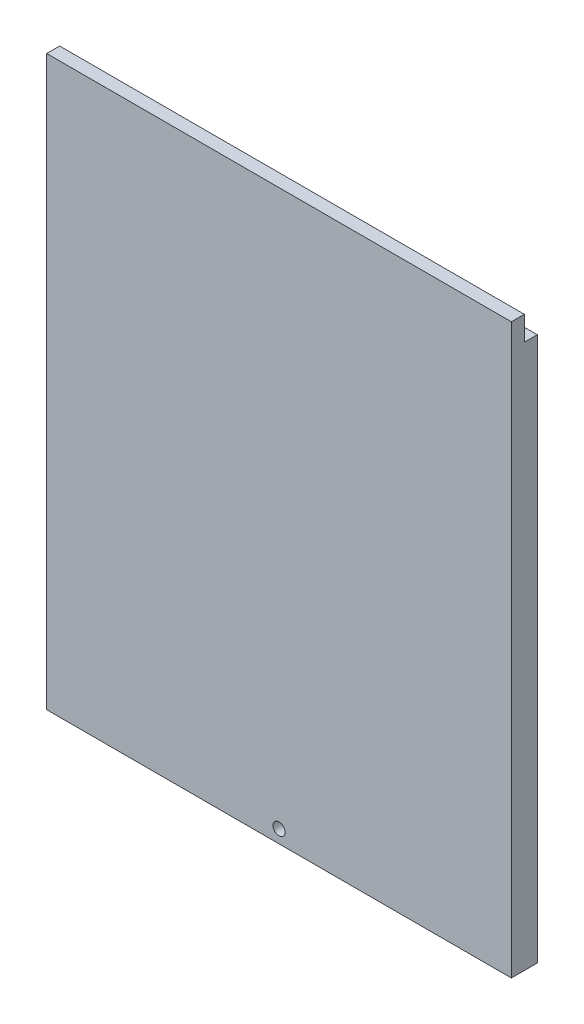
ISO-10303-21;
HEADER;
FILE_DESCRIPTION(('STEP AP214'),'2;1');
FILE_NAME('part.step','',(''),(''),'','','');
FILE_SCHEMA(('AUTOMOTIVE_DESIGN { 1 0 10303 214 1 1 1 1 }'));
ENDSEC;
DATA;
#1=APPLICATION_CONTEXT('core data for automotive mechanical design processes');
#2=APPLICATION_PROTOCOL_DEFINITION('international standard','automotive_design',2000,#1);
#3=PRODUCT_CONTEXT('',#1,'mechanical');
#4=PRODUCT('Part','Part','',(#3));
#5=PRODUCT_RELATED_PRODUCT_CATEGORY('part','',(#4));
#6=PRODUCT_DEFINITION_FORMATION('','',#4);
#7=PRODUCT_DEFINITION_CONTEXT('part definition',#1,'design');
#8=PRODUCT_DEFINITION('design','',#6,#7);
#9=PRODUCT_DEFINITION_SHAPE('','',#8);
#10=(LENGTH_UNIT() NAMED_UNIT(*) SI_UNIT(.MILLI.,.METRE.));
#11=(NAMED_UNIT(*) PLANE_ANGLE_UNIT() SI_UNIT($,.RADIAN.));
#12=(NAMED_UNIT(*) SI_UNIT($,.STERADIAN.) SOLID_ANGLE_UNIT());
#13=UNCERTAINTY_MEASURE_WITH_UNIT(LENGTH_MEASURE(1.E-05),#10,'distance_accuracy_value','');
#14=(GEOMETRIC_REPRESENTATION_CONTEXT(3) GLOBAL_UNCERTAINTY_ASSIGNED_CONTEXT((#13)) GLOBAL_UNIT_ASSIGNED_CONTEXT((#10,
#11,#12)) REPRESENTATION_CONTEXT('',''));
#15=CARTESIAN_POINT('',(0.,0.,0.));
#16=DIRECTION('',(0.,0.,1.));
#17=DIRECTION('',(1.,0.,0.));
#18=AXIS2_PLACEMENT_3D('',#15,#16,#17);
#19=CARTESIAN_POINT('',(-26.9,31.5,3.));
#20=DIRECTION('',(1.,0.,0.));
#21=DIRECTION('',(0.,0.,-1.));
#22=AXIS2_PLACEMENT_3D('',#19,#20,#21);
#23=PLANE('',#22);
#24=DIRECTION('',(0.,-1.,0.));
#25=VECTOR('',#24,1.);
#26=CARTESIAN_POINT('',(-26.9,31.5,0.));
#27=LINE('',#26,#25);
#28=CARTESIAN_POINT('',(-26.9,31.5,0.));
#29=VERTEX_POINT('',#28);
#30=CARTESIAN_POINT('',(-26.9,-31.5,0.));
#31=VERTEX_POINT('',#30);
#32=EDGE_CURVE('E87',#29,#31,#27,.T.);
#33=ORIENTED_EDGE('',*,*,#32,.T.);
#34=DIRECTION('',(0.,0.,-1.));
#35=VECTOR('',#34,1.);
#36=CARTESIAN_POINT('',(-26.9,-31.5,3.));
#37=LINE('',#36,#35);
#38=CARTESIAN_POINT('',(-26.9,-31.5,3.));
#39=VERTEX_POINT('',#38);
#40=EDGE_CURVE('E11',#39,#31,#37,.T.);
#41=ORIENTED_EDGE('',*,*,#40,.F.);
#42=DIRECTION('',(0.,-1.,0.));
#43=VECTOR('',#42,1.);
#44=CARTESIAN_POINT('',(-26.9,31.5,3.));
#45=LINE('',#44,#43);
#46=CARTESIAN_POINT('',(-26.9,34.3,3.));
#47=VERTEX_POINT('',#46);
#48=EDGE_CURVE('E103',#47,#39,#45,.T.);
#49=ORIENTED_EDGE('',*,*,#48,.F.);
#50=DIRECTION('',(0.,0.,1.));
#51=VECTOR('',#50,1.);
#52=CARTESIAN_POINT('',(-26.9,34.3,1.5));
#53=LINE('',#52,#51);
#54=CARTESIAN_POINT('',(-26.9,34.3,1.5));
#55=VERTEX_POINT('',#54);
#56=EDGE_CURVE('E127',#55,#47,#53,.T.);
#57=ORIENTED_EDGE('',*,*,#56,.F.);
#58=DIRECTION('',(0.,-1.,0.));
#59=VECTOR('',#58,1.);
#60=CARTESIAN_POINT('',(-26.9,34.3,1.5));
#61=LINE('',#60,#59);
#62=CARTESIAN_POINT('',(-26.9,31.5,1.5));
#63=VERTEX_POINT('',#62);
#64=EDGE_CURVE('E91',#55,#63,#61,.T.);
#65=ORIENTED_EDGE('',*,*,#64,.T.);
#66=DIRECTION('',(0.,0.,-1.));
#67=VECTOR('',#66,1.);
#68=CARTESIAN_POINT('',(-26.9,31.5,3.));
#69=LINE('',#68,#67);
#70=EDGE_CURVE('E83',#63,#29,#69,.T.);
#71=ORIENTED_EDGE('',*,*,#70,.T.);
#72=EDGE_LOOP('',(#33,#41,#49,#57,#65,#71));
#73=FACE_BOUND('',#72,.T.);
#74=ADVANCED_FACE('F39',(#73),#23,.F.);
#75=CARTESIAN_POINT('',(-26.9,-31.5,3.));
#76=DIRECTION('',(0.,1.,0.));
#77=DIRECTION('',(0.,0.,1.));
#78=AXIS2_PLACEMENT_3D('',#75,#76,#77);
#79=PLANE('',#78);
#80=DIRECTION('',(1.,0.,0.));
#81=VECTOR('',#80,1.);
#82=CARTESIAN_POINT('',(-26.9,-31.5,0.));
#83=LINE('',#82,#81);
#84=CARTESIAN_POINT('',(26.9,-31.5,0.));
#85=VERTEX_POINT('',#84);
#86=EDGE_CURVE('E107',#31,#85,#83,.T.);
#87=ORIENTED_EDGE('',*,*,#86,.T.);
#88=DIRECTION('',(0.,0.,-1.));
#89=VECTOR('',#88,1.);
#90=CARTESIAN_POINT('',(26.9,-31.5,3.));
#91=LINE('',#90,#89);
#92=CARTESIAN_POINT('',(26.9,-31.5,3.));
#93=VERTEX_POINT('',#92);
#94=EDGE_CURVE('E47',#93,#85,#91,.T.);
#95=ORIENTED_EDGE('',*,*,#94,.F.);
#96=DIRECTION('',(1.,0.,0.));
#97=VECTOR('',#96,1.);
#98=CARTESIAN_POINT('',(-26.9,-31.5,3.));
#99=LINE('',#98,#97);
#100=EDGE_CURVE('E63',#39,#93,#99,.T.);
#101=ORIENTED_EDGE('',*,*,#100,.F.);
#102=ORIENTED_EDGE('',*,*,#40,.T.);
#103=EDGE_LOOP('',(#87,#95,#101,#102));
#104=FACE_BOUND('',#103,.T.);
#105=ADVANCED_FACE('F122',(#104),#79,.F.);
#106=CARTESIAN_POINT('',(26.9,31.5,3.));
#107=DIRECTION('',(-1.,0.,0.));
#108=DIRECTION('',(0.,0.,1.));
#109=AXIS2_PLACEMENT_3D('',#106,#107,#108);
#110=PLANE('',#109);
#111=DIRECTION('',(0.,1.,0.));
#112=VECTOR('',#111,1.);
#113=CARTESIAN_POINT('',(26.9,31.5,0.));
#114=LINE('',#113,#112);
#115=CARTESIAN_POINT('',(26.9,31.5,0.));
#116=VERTEX_POINT('',#115);
#117=EDGE_CURVE('E104',#85,#116,#114,.T.);
#118=ORIENTED_EDGE('',*,*,#117,.T.);
#119=DIRECTION('',(0.,0.,-1.));
#120=VECTOR('',#119,1.);
#121=CARTESIAN_POINT('',(26.9,31.5,3.));
#122=LINE('',#121,#120);
#123=CARTESIAN_POINT('',(26.9,31.5,1.5));
#124=VERTEX_POINT('',#123);
#125=EDGE_CURVE('E93',#124,#116,#122,.T.);
#126=ORIENTED_EDGE('',*,*,#125,.F.);
#127=DIRECTION('',(0.,-1.,0.));
#128=VECTOR('',#127,1.);
#129=CARTESIAN_POINT('',(26.9,34.3,1.5));
#130=LINE('',#129,#128);
#131=CARTESIAN_POINT('',(26.9,34.3,1.5));
#132=VERTEX_POINT('',#131);
#133=EDGE_CURVE('E54',#132,#124,#130,.T.);
#134=ORIENTED_EDGE('',*,*,#133,.F.);
#135=DIRECTION('',(0.,0.,1.));
#136=VECTOR('',#135,1.);
#137=CARTESIAN_POINT('',(26.9,34.3,1.5));
#138=LINE('',#137,#136);
#139=CARTESIAN_POINT('',(26.9,34.3,3.));
#140=VERTEX_POINT('',#139);
#141=EDGE_CURVE('E137',#132,#140,#138,.T.);
#142=ORIENTED_EDGE('',*,*,#141,.T.);
#143=DIRECTION('',(0.,1.,0.));
#144=VECTOR('',#143,1.);
#145=CARTESIAN_POINT('',(26.9,31.5,3.));
#146=LINE('',#145,#144);
#147=EDGE_CURVE('E94',#93,#140,#146,.T.);
#148=ORIENTED_EDGE('',*,*,#147,.F.);
#149=ORIENTED_EDGE('',*,*,#94,.T.);
#150=EDGE_LOOP('',(#118,#126,#134,#142,#148,#149));
#151=FACE_BOUND('',#150,.T.);
#152=ADVANCED_FACE('F119',(#151),#110,.F.);
#153=CARTESIAN_POINT('',(-26.9,31.5,3.));
#154=DIRECTION('',(0.,-1.,0.));
#155=DIRECTION('',(0.,0.,-1.));
#156=AXIS2_PLACEMENT_3D('',#153,#154,#155);
#157=PLANE('',#156);
#158=ORIENTED_EDGE('',*,*,#70,.F.);
#159=DIRECTION('',(1.,0.,0.));
#160=VECTOR('',#159,1.);
#161=CARTESIAN_POINT('',(-26.9,31.5,1.5));
#162=LINE('',#161,#160);
#163=EDGE_CURVE('E141',#63,#124,#162,.T.);
#164=ORIENTED_EDGE('',*,*,#163,.T.);
#165=ORIENTED_EDGE('',*,*,#125,.T.);
#166=DIRECTION('',(-1.,0.,0.));
#167=VECTOR('',#166,1.);
#168=CARTESIAN_POINT('',(-26.9,31.5,0.));
#169=LINE('',#168,#167);
#170=EDGE_CURVE('E97',#116,#29,#169,.T.);
#171=ORIENTED_EDGE('',*,*,#170,.T.);
#172=EDGE_LOOP('',(#158,#164,#165,#171));
#173=FACE_BOUND('',#172,.T.);
#174=ADVANCED_FACE('F98',(#173),#157,.F.);
#175=CARTESIAN_POINT('',(0.,0.,3.));
#176=DIRECTION('',(0.,0.,1.));
#177=DIRECTION('',(1.,0.,0.));
#178=AXIS2_PLACEMENT_3D('',#175,#176,#177);
#179=PLANE('',#178);
#180=CARTESIAN_POINT('',(0.,-30.,3.));
#181=DIRECTION('',(0.,0.,-1.));
#182=DIRECTION('',(-1.,0.,0.));
#183=AXIS2_PLACEMENT_3D('',#180,#181,#182);
#184=CIRCLE('',#183,0.7);
#185=CARTESIAN_POINT('',(-0.699999999999996,-30.,3.));
#186=VERTEX_POINT('',#185);
#187=EDGE_CURVE('E183',#186,#186,#184,.T.);
#188=ORIENTED_EDGE('',*,*,#187,.T.);
#189=EDGE_LOOP('',(#188));
#190=FACE_BOUND('',#189,.T.);
#191=ORIENTED_EDGE('',*,*,#48,.T.);
#192=ORIENTED_EDGE('',*,*,#100,.T.);
#193=ORIENTED_EDGE('',*,*,#147,.T.);
#194=DIRECTION('',(1.,0.,0.));
#195=VECTOR('',#194,1.);
#196=CARTESIAN_POINT('',(-26.9,34.3,3.));
#197=LINE('',#196,#195);
#198=EDGE_CURVE('E133',#47,#140,#197,.T.);
#199=ORIENTED_EDGE('',*,*,#198,.F.);
#200=EDGE_LOOP('',(#191,#192,#193,#199));
#201=FACE_BOUND('',#200,.T.);
#202=ADVANCED_FACE('F134',(#190,#201),#179,.T.);
#203=CARTESIAN_POINT('',(0.,0.,0.));
#204=DIRECTION('',(0.,0.,1.));
#205=DIRECTION('',(1.,0.,0.));
#206=AXIS2_PLACEMENT_3D('',#203,#204,#205);
#207=PLANE('',#206);
#208=CARTESIAN_POINT('',(0.,-30.,0.));
#209=DIRECTION('',(0.,0.,-1.));
#210=DIRECTION('',(-1.,0.,0.));
#211=AXIS2_PLACEMENT_3D('',#208,#209,#210);
#212=CIRCLE('',#211,1.);
#213=CARTESIAN_POINT('',(-0.999999999999997,-30.,0.));
#214=VERTEX_POINT('',#213);
#215=EDGE_CURVE('E146',#214,#214,#212,.T.);
#216=ORIENTED_EDGE('',*,*,#215,.F.);
#217=EDGE_LOOP('',(#216));
#218=FACE_BOUND('',#217,.T.);
#219=ORIENTED_EDGE('',*,*,#32,.F.);
#220=ORIENTED_EDGE('',*,*,#170,.F.);
#221=ORIENTED_EDGE('',*,*,#117,.F.);
#222=ORIENTED_EDGE('',*,*,#86,.F.);
#223=EDGE_LOOP('',(#219,#220,#221,#222));
#224=FACE_BOUND('',#223,.T.);
#225=ADVANCED_FACE('F106',(#218,#224),#207,.F.);
#226=CARTESIAN_POINT('',(-26.9,34.3,1.5));
#227=DIRECTION('',(0.,0.,-1.));
#228=DIRECTION('',(-1.,0.,0.));
#229=AXIS2_PLACEMENT_3D('',#226,#227,#228);
#230=PLANE('',#229);
#231=ORIENTED_EDGE('',*,*,#163,.F.);
#232=ORIENTED_EDGE('',*,*,#64,.F.);
#233=DIRECTION('',(1.,0.,0.));
#234=VECTOR('',#233,1.);
#235=CARTESIAN_POINT('',(-26.9,34.3,1.5));
#236=LINE('',#235,#234);
#237=EDGE_CURVE('E140',#55,#132,#236,.T.);
#238=ORIENTED_EDGE('',*,*,#237,.T.);
#239=ORIENTED_EDGE('',*,*,#133,.T.);
#240=EDGE_LOOP('',(#231,#232,#238,#239));
#241=FACE_BOUND('',#240,.T.);
#242=ADVANCED_FACE('F152',(#241),#230,.T.);
#243=CARTESIAN_POINT('',(0.,34.3,0.));
#244=DIRECTION('',(0.,1.,0.));
#245=DIRECTION('',(0.,0.,1.));
#246=AXIS2_PLACEMENT_3D('',#243,#244,#245);
#247=PLANE('',#246);
#248=ORIENTED_EDGE('',*,*,#56,.T.);
#249=ORIENTED_EDGE('',*,*,#198,.T.);
#250=ORIENTED_EDGE('',*,*,#141,.F.);
#251=ORIENTED_EDGE('',*,*,#237,.F.);
#252=EDGE_LOOP('',(#248,#249,#250,#251));
#253=FACE_BOUND('',#252,.T.);
#254=ADVANCED_FACE('F139',(#253),#247,.T.);
#255=CARTESIAN_POINT('',(0.,-30.,1.5));
#256=DIRECTION('',(0.,0.,-1.));
#257=DIRECTION('',(-1.,0.,0.));
#258=AXIS2_PLACEMENT_3D('',#255,#256,#257);
#259=CYLINDRICAL_SURFACE('',#258,1.);
#260=CARTESIAN_POINT('',(0.,-30.,1.5));
#261=DIRECTION('',(0.,0.,-1.));
#262=DIRECTION('',(-1.,0.,0.));
#263=AXIS2_PLACEMENT_3D('',#260,#261,#262);
#264=CIRCLE('',#263,1.);
#265=CARTESIAN_POINT('',(-0.999999999999997,-30.,1.5));
#266=VERTEX_POINT('',#265);
#267=EDGE_CURVE('E143',#266,#266,#264,.T.);
#268=ORIENTED_EDGE('',*,*,#267,.F.);
#269=EDGE_LOOP('',(#268));
#270=FACE_BOUND('',#269,.T.);
#271=ORIENTED_EDGE('',*,*,#215,.T.);
#272=EDGE_LOOP('',(#271));
#273=FACE_BOUND('',#272,.T.);
#274=ADVANCED_FACE('F162',(#270,#273),#259,.F.);
#275=CARTESIAN_POINT('',(0.,-30.,1.5));
#276=DIRECTION('',(0.,0.,-1.));
#277=DIRECTION('',(-1.,0.,0.));
#278=AXIS2_PLACEMENT_3D('',#275,#276,#277);
#279=PLANE('',#278);
#280=CARTESIAN_POINT('',(0.,-30.,1.5));
#281=DIRECTION('',(0.,0.,-1.));
#282=DIRECTION('',(-1.,0.,0.));
#283=AXIS2_PLACEMENT_3D('',#280,#281,#282);
#284=CIRCLE('',#283,0.7);
#285=CARTESIAN_POINT('',(-0.699999999999996,-30.,1.5));
#286=VERTEX_POINT('',#285);
#287=EDGE_CURVE('E42',#286,#286,#284,.T.);
#288=ORIENTED_EDGE('',*,*,#287,.F.);
#289=EDGE_LOOP('',(#288));
#290=FACE_BOUND('',#289,.T.);
#291=ORIENTED_EDGE('',*,*,#267,.T.);
#292=EDGE_LOOP('',(#291));
#293=FACE_BOUND('',#292,.T.);
#294=ADVANCED_FACE('F194',(#290,#293),#279,.T.);
#295=CARTESIAN_POINT('',(0.,-30.,3.));
#296=DIRECTION('',(0.,0.,-1.));
#297=DIRECTION('',(-1.,0.,0.));
#298=AXIS2_PLACEMENT_3D('',#295,#296,#297);
#299=CYLINDRICAL_SURFACE('',#298,0.7);
#300=ORIENTED_EDGE('',*,*,#287,.T.);
#301=EDGE_LOOP('',(#300));
#302=FACE_BOUND('',#301,.T.);
#303=ORIENTED_EDGE('',*,*,#187,.F.);
#304=EDGE_LOOP('',(#303));
#305=FACE_BOUND('',#304,.T.);
#306=ADVANCED_FACE('F200',(#302,#305),#299,.F.);
#307=CLOSED_SHELL('',(#74,#105,#152,#174,#202,#225,#242,#254,#274,#294,#306));
#308=MANIFOLD_SOLID_BREP('B2',#307);
#309=ADVANCED_BREP_SHAPE_REPRESENTATION('',(#18,#308),#14);
#310=SHAPE_DEFINITION_REPRESENTATION(#9,#309);
ENDSEC;
END-ISO-10303-21;
